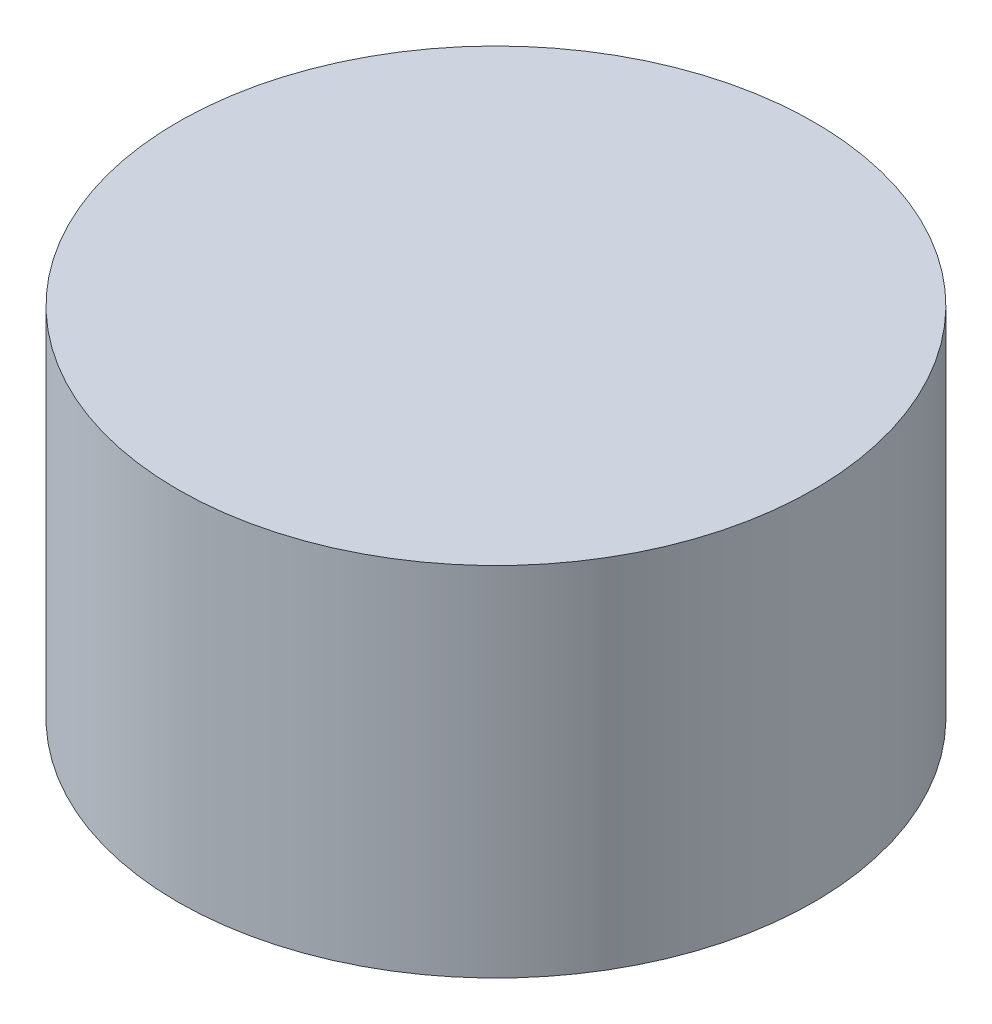
ISO-10303-21;
HEADER;
FILE_DESCRIPTION(('STEP AP214'),'2;1');
FILE_NAME('part.step','',(''),(''),'','','');
FILE_SCHEMA(('AUTOMOTIVE_DESIGN { 1 0 10303 214 1 1 1 1 }'));
ENDSEC;
DATA;
#1=APPLICATION_CONTEXT('core data for automotive mechanical design processes');
#2=APPLICATION_PROTOCOL_DEFINITION('international standard','automotive_design',2000,#1);
#3=PRODUCT_CONTEXT('',#1,'mechanical');
#4=PRODUCT('Part','Part','',(#3));
#5=PRODUCT_RELATED_PRODUCT_CATEGORY('part','',(#4));
#6=PRODUCT_DEFINITION_FORMATION('','',#4);
#7=PRODUCT_DEFINITION_CONTEXT('part definition',#1,'design');
#8=PRODUCT_DEFINITION('design','',#6,#7);
#9=PRODUCT_DEFINITION_SHAPE('','',#8);
#10=(LENGTH_UNIT() NAMED_UNIT(*) SI_UNIT(.MILLI.,.METRE.));
#11=(NAMED_UNIT(*) PLANE_ANGLE_UNIT() SI_UNIT($,.RADIAN.));
#12=(NAMED_UNIT(*) SI_UNIT($,.STERADIAN.) SOLID_ANGLE_UNIT());
#13=UNCERTAINTY_MEASURE_WITH_UNIT(LENGTH_MEASURE(1.E-05),#10,'distance_accuracy_value','');
#14=(GEOMETRIC_REPRESENTATION_CONTEXT(3) GLOBAL_UNCERTAINTY_ASSIGNED_CONTEXT((#13)) GLOBAL_UNIT_ASSIGNED_CONTEXT((#10,
#11,#12)) REPRESENTATION_CONTEXT('',''));
#15=CARTESIAN_POINT('',(0.,0.,0.));
#16=DIRECTION('',(0.,0.,1.));
#17=DIRECTION('',(1.,0.,0.));
#18=AXIS2_PLACEMENT_3D('',#15,#16,#17);
#19=CARTESIAN_POINT('',(0.,16.,0.));
#20=DIRECTION('',(0.,-1.,0.));
#21=DIRECTION('',(0.,0.,-1.));
#22=AXIS2_PLACEMENT_3D('',#19,#20,#21);
#23=CYLINDRICAL_SURFACE('',#22,14.25);
#24=CARTESIAN_POINT('',(0.,16.,0.));
#25=DIRECTION('',(0.,1.,0.));
#26=DIRECTION('',(0.,0.,1.));
#27=AXIS2_PLACEMENT_3D('',#24,#25,#26);
#28=CIRCLE('',#27,14.25);
#29=CARTESIAN_POINT('',(0.,16.,14.25));
#30=VERTEX_POINT('',#29);
#31=EDGE_CURVE('E10',#30,#30,#28,.T.);
#32=ORIENTED_EDGE('',*,*,#31,.F.);
#33=EDGE_LOOP('',(#32));
#34=FACE_BOUND('',#33,.T.);
#35=CARTESIAN_POINT('',(0.,0.,0.));
#36=DIRECTION('',(0.,1.,0.));
#37=DIRECTION('',(0.,0.,1.));
#38=AXIS2_PLACEMENT_3D('',#35,#36,#37);
#39=CIRCLE('',#38,14.25);
#40=CARTESIAN_POINT('',(0.,0.,14.25));
#41=VERTEX_POINT('',#40);
#42=EDGE_CURVE('E34',#41,#41,#39,.T.);
#43=ORIENTED_EDGE('',*,*,#42,.T.);
#44=EDGE_LOOP('',(#43));
#45=FACE_BOUND('',#44,.T.);
#46=ADVANCED_FACE('F31',(#34,#45),#23,.T.);
#47=CARTESIAN_POINT('',(0.,16.,0.));
#48=DIRECTION('',(0.,1.,0.));
#49=DIRECTION('',(0.,0.,1.));
#50=AXIS2_PLACEMENT_3D('',#47,#48,#49);
#51=PLANE('',#50);
#52=ORIENTED_EDGE('',*,*,#31,.T.);
#53=EDGE_LOOP('',(#52));
#54=FACE_BOUND('',#53,.T.);
#55=ADVANCED_FACE('F46',(#54),#51,.T.);
#56=CARTESIAN_POINT('',(0.,0.,0.));
#57=DIRECTION('',(0.,1.,0.));
#58=DIRECTION('',(0.,0.,1.));
#59=AXIS2_PLACEMENT_3D('',#56,#57,#58);
#60=PLANE('',#59);
#61=ORIENTED_EDGE('',*,*,#42,.F.);
#62=EDGE_LOOP('',(#61));
#63=FACE_BOUND('',#62,.T.);
#64=ADVANCED_FACE('F44',(#63),#60,.F.);
#65=CLOSED_SHELL('',(#46,#55,#64));
#66=MANIFOLD_SOLID_BREP('B2',#65);
#67=ADVANCED_BREP_SHAPE_REPRESENTATION('',(#18,#66),#14);
#68=SHAPE_DEFINITION_REPRESENTATION(#9,#67);
ENDSEC;
END-ISO-10303-21;
